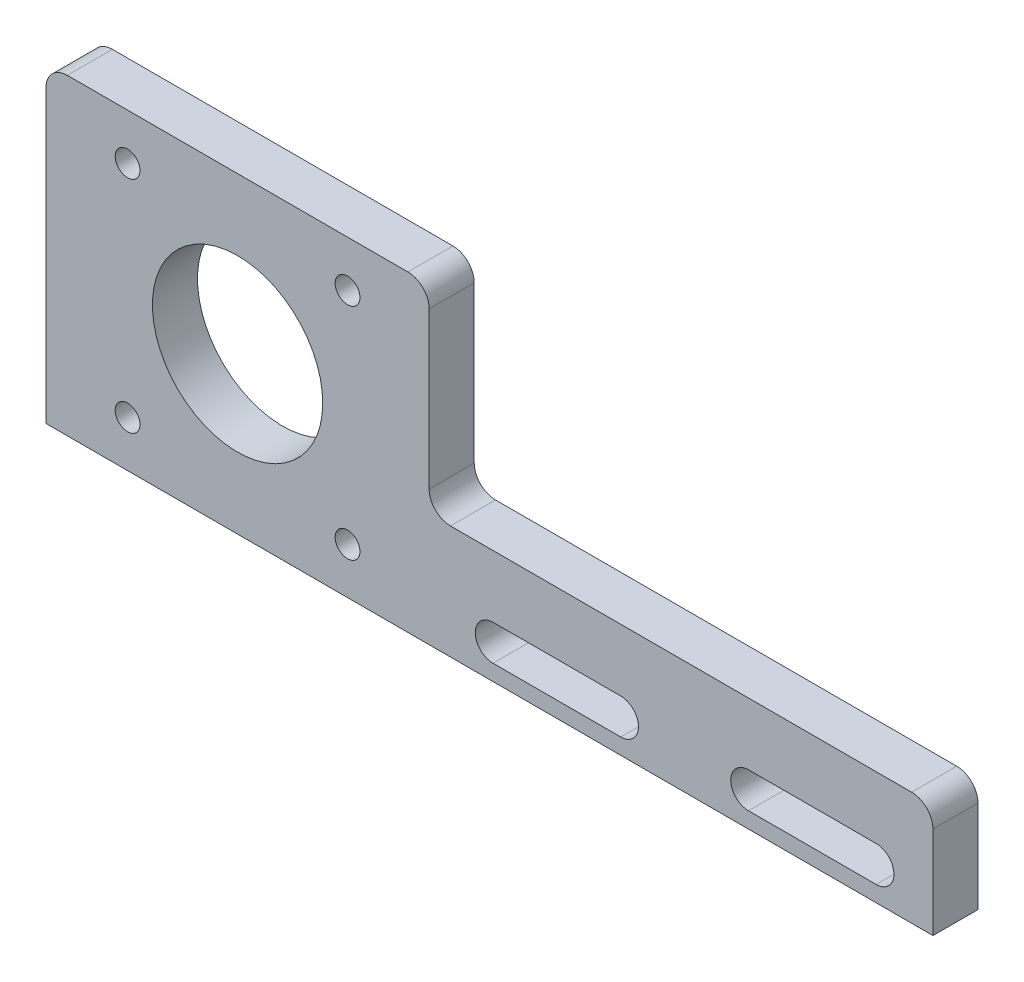
ISO-10303-21;
HEADER;
FILE_DESCRIPTION(('STEP AP214'),'2;1');
FILE_NAME('part.step','',(''),(''),'','','');
FILE_SCHEMA(('AUTOMOTIVE_DESIGN { 1 0 10303 214 1 1 1 1 }'));
ENDSEC;
DATA;
#1=APPLICATION_CONTEXT('core data for automotive mechanical design processes');
#2=APPLICATION_PROTOCOL_DEFINITION('international standard','automotive_design',2000,#1);
#3=PRODUCT_CONTEXT('',#1,'mechanical');
#4=PRODUCT('Part','Part','',(#3));
#5=PRODUCT_RELATED_PRODUCT_CATEGORY('part','',(#4));
#6=PRODUCT_DEFINITION_FORMATION('','',#4);
#7=PRODUCT_DEFINITION_CONTEXT('part definition',#1,'design');
#8=PRODUCT_DEFINITION('design','',#6,#7);
#9=PRODUCT_DEFINITION_SHAPE('','',#8);
#10=(LENGTH_UNIT() NAMED_UNIT(*) SI_UNIT(.MILLI.,.METRE.));
#11=(NAMED_UNIT(*) PLANE_ANGLE_UNIT() SI_UNIT($,.RADIAN.));
#12=(NAMED_UNIT(*) SI_UNIT($,.STERADIAN.) SOLID_ANGLE_UNIT());
#13=UNCERTAINTY_MEASURE_WITH_UNIT(LENGTH_MEASURE(1.E-05),#10,'distance_accuracy_value','');
#14=(GEOMETRIC_REPRESENTATION_CONTEXT(3) GLOBAL_UNCERTAINTY_ASSIGNED_CONTEXT((#13)) GLOBAL_UNIT_ASSIGNED_CONTEXT((#10,
#11,#12)) REPRESENTATION_CONTEXT('',''));
#15=CARTESIAN_POINT('',(0.,0.,0.));
#16=DIRECTION('',(0.,0.,1.));
#17=DIRECTION('',(1.,0.,0.));
#18=AXIS2_PLACEMENT_3D('',#15,#16,#17);
#19=CARTESIAN_POINT('',(0.,0.,6.35));
#20=DIRECTION('',(0.,0.,-1.));
#21=DIRECTION('',(-1.,0.,0.));
#22=AXIS2_PLACEMENT_3D('',#19,#20,#21);
#23=PLANE('',#22);
#24=CARTESIAN_POINT('',(71.5,-25.76,6.35));
#25=DIRECTION('',(0.,0.,1.));
#26=DIRECTION('',(1.,0.,0.));
#27=AXIS2_PLACEMENT_3D('',#24,#25,#26);
#28=CIRCLE('',#27,2.5);
#29=CARTESIAN_POINT('',(71.5,-23.26,6.35));
#30=VERTEX_POINT('',#29);
#31=CARTESIAN_POINT('',(71.5,-28.26,6.35));
#32=VERTEX_POINT('',#31);
#33=EDGE_CURVE('E205',#30,#32,#28,.T.);
#34=ORIENTED_EDGE('',*,*,#33,.F.);
#35=DIRECTION('',(-1.,0.,0.));
#36=VECTOR('',#35,1.);
#37=CARTESIAN_POINT('',(71.5,-23.26,6.35));
#38=LINE('',#37,#36);
#39=CARTESIAN_POINT('',(89.5,-23.26,6.35));
#40=VERTEX_POINT('',#39);
#41=EDGE_CURVE('E213',#40,#30,#38,.T.);
#42=ORIENTED_EDGE('',*,*,#41,.F.);
#43=CARTESIAN_POINT('',(89.5,-25.76,6.35));
#44=DIRECTION('',(0.,0.,1.));
#45=DIRECTION('',(1.,0.,0.));
#46=AXIS2_PLACEMENT_3D('',#43,#44,#45);
#47=CIRCLE('',#46,2.5);
#48=CARTESIAN_POINT('',(89.5,-28.26,6.35));
#49=VERTEX_POINT('',#48);
#50=EDGE_CURVE('E210',#49,#40,#47,.T.);
#51=ORIENTED_EDGE('',*,*,#50,.F.);
#52=DIRECTION('',(1.,0.,0.));
#53=VECTOR('',#52,1.);
#54=CARTESIAN_POINT('',(71.5,-28.26,6.35));
#55=LINE('',#54,#53);
#56=EDGE_CURVE('E207',#32,#49,#55,.T.);
#57=ORIENTED_EDGE('',*,*,#56,.F.);
#58=EDGE_LOOP('',(#34,#42,#51,#57));
#59=FACE_BOUND('',#58,.T.);
#60=CARTESIAN_POINT('',(-16.,-24.,6.35));
#61=DIRECTION('',(0.,0.,1.));
#62=DIRECTION('',(1.,0.,0.));
#63=AXIS2_PLACEMENT_3D('',#60,#61,#62);
#64=CIRCLE('',#63,1.75000000000001);
#65=CARTESIAN_POINT('',(-14.25,-24.,6.35));
#66=VERTEX_POINT('',#65);
#67=EDGE_CURVE('E242',#66,#66,#64,.T.);
#68=ORIENTED_EDGE('',*,*,#67,.F.);
#69=EDGE_LOOP('',(#68));
#70=FACE_BOUND('',#69,.T.);
#71=CARTESIAN_POINT('',(15.,6.99999999999999,6.35));
#72=DIRECTION('',(0.,0.,1.));
#73=DIRECTION('',(1.,0.,0.));
#74=AXIS2_PLACEMENT_3D('',#71,#72,#73);
#75=CIRCLE('',#74,1.75);
#76=CARTESIAN_POINT('',(16.75,6.99999999999999,6.35));
#77=VERTEX_POINT('',#76);
#78=EDGE_CURVE('E254',#77,#77,#75,.T.);
#79=ORIENTED_EDGE('',*,*,#78,.F.);
#80=EDGE_LOOP('',(#79));
#81=FACE_BOUND('',#80,.T.);
#82=DIRECTION('',(0.,1.,0.));
#83=VECTOR('',#82,1.);
#84=CARTESIAN_POINT('',(97.5,-30.5,6.35));
#85=LINE('',#84,#83);
#86=CARTESIAN_POINT('',(97.5,-30.5,6.35));
#87=VERTEX_POINT('',#86);
#88=CARTESIAN_POINT('',(97.5,-17.5,6.35));
#89=VERTEX_POINT('',#88);
#90=EDGE_CURVE('E271',#87,#89,#85,.T.);
#91=ORIENTED_EDGE('',*,*,#90,.T.);
#92=CARTESIAN_POINT('',(94.5,-17.5,6.35));
#93=DIRECTION('',(0.,0.,-1.));
#94=DIRECTION('',(-1.,0.,0.));
#95=AXIS2_PLACEMENT_3D('',#92,#93,#94);
#96=CIRCLE('',#95,3.);
#97=CARTESIAN_POINT('',(94.5,-14.5,6.35));
#98=VERTEX_POINT('',#97);
#99=EDGE_CURVE('E316',#89,#98,#96,.F.);
#100=ORIENTED_EDGE('',*,*,#99,.T.);
#101=DIRECTION('',(-1.,0.,0.));
#102=VECTOR('',#101,1.);
#103=CARTESIAN_POINT('',(97.5,-14.5,6.35));
#104=LINE('',#103,#102);
#105=CARTESIAN_POINT('',(29.5,-14.5,6.35));
#106=VERTEX_POINT('',#105);
#107=EDGE_CURVE('E274',#98,#106,#104,.T.);
#108=ORIENTED_EDGE('',*,*,#107,.T.);
#109=CARTESIAN_POINT('',(29.5,-11.5,6.35));
#110=DIRECTION('',(0.,0.,-1.));
#111=DIRECTION('',(-1.,0.,0.));
#112=AXIS2_PLACEMENT_3D('',#109,#110,#111);
#113=CIRCLE('',#112,3.);
#114=CARTESIAN_POINT('',(26.5,-11.5,6.35));
#115=VERTEX_POINT('',#114);
#116=EDGE_CURVE('E11',#106,#115,#113,.T.);
#117=ORIENTED_EDGE('',*,*,#116,.T.);
#118=DIRECTION('',(0.,1.,0.));
#119=VECTOR('',#118,1.);
#120=CARTESIAN_POINT('',(26.5,13.5,6.35));
#121=LINE('',#120,#119);
#122=CARTESIAN_POINT('',(26.5,10.5,6.35));
#123=VERTEX_POINT('',#122);
#124=EDGE_CURVE('E277',#115,#123,#121,.T.);
#125=ORIENTED_EDGE('',*,*,#124,.T.);
#126=CARTESIAN_POINT('',(23.5,10.5,6.35));
#127=DIRECTION('',(0.,0.,-1.));
#128=DIRECTION('',(-1.,0.,0.));
#129=AXIS2_PLACEMENT_3D('',#126,#127,#128);
#130=CIRCLE('',#129,3.);
#131=CARTESIAN_POINT('',(23.5,13.5,6.35));
#132=VERTEX_POINT('',#131);
#133=EDGE_CURVE('E59',#123,#132,#130,.F.);
#134=ORIENTED_EDGE('',*,*,#133,.T.);
#135=DIRECTION('',(-1.,0.,0.));
#136=VECTOR('',#135,1.);
#137=CARTESIAN_POINT('',(-27.5,13.5,6.35));
#138=LINE('',#137,#136);
#139=CARTESIAN_POINT('',(-24.5,13.5,6.35));
#140=VERTEX_POINT('',#139);
#141=EDGE_CURVE('E279',#132,#140,#138,.T.);
#142=ORIENTED_EDGE('',*,*,#141,.T.);
#143=CARTESIAN_POINT('',(-24.5,10.5,6.35));
#144=DIRECTION('',(0.,0.,-1.));
#145=DIRECTION('',(-1.,0.,0.));
#146=AXIS2_PLACEMENT_3D('',#143,#144,#145);
#147=CIRCLE('',#146,3.);
#148=CARTESIAN_POINT('',(-27.5,10.5,6.35));
#149=VERTEX_POINT('',#148);
#150=EDGE_CURVE('E313',#140,#149,#147,.F.);
#151=ORIENTED_EDGE('',*,*,#150,.T.);
#152=DIRECTION('',(0.,-1.,0.));
#153=VECTOR('',#152,1.);
#154=CARTESIAN_POINT('',(-27.5,-30.5,6.35));
#155=LINE('',#154,#153);
#156=CARTESIAN_POINT('',(-27.5,-30.5,6.35));
#157=VERTEX_POINT('',#156);
#158=EDGE_CURVE('E266',#149,#157,#155,.T.);
#159=ORIENTED_EDGE('',*,*,#158,.T.);
#160=DIRECTION('',(1.,0.,0.));
#161=VECTOR('',#160,1.);
#162=CARTESIAN_POINT('',(-27.5,-30.5,6.35));
#163=LINE('',#162,#161);
#164=EDGE_CURVE('E268',#157,#87,#163,.T.);
#165=ORIENTED_EDGE('',*,*,#164,.T.);
#166=EDGE_LOOP('',(#91,#100,#108,#117,#125,#134,#142,#151,#159,#165));
#167=FACE_BOUND('',#166,.T.);
#168=CARTESIAN_POINT('',(-16.,6.99999999999999,6.35));
#169=DIRECTION('',(0.,0.,1.));
#170=DIRECTION('',(1.,0.,0.));
#171=AXIS2_PLACEMENT_3D('',#168,#169,#170);
#172=CIRCLE('',#171,1.75000000000001);
#173=CARTESIAN_POINT('',(-14.25,6.99999999999999,6.35));
#174=VERTEX_POINT('',#173);
#175=EDGE_CURVE('E260',#174,#174,#172,.T.);
#176=ORIENTED_EDGE('',*,*,#175,.F.);
#177=EDGE_LOOP('',(#176));
#178=FACE_BOUND('',#177,.T.);
#179=CARTESIAN_POINT('',(15.,-24.,6.35));
#180=DIRECTION('',(0.,0.,1.));
#181=DIRECTION('',(1.,0.,0.));
#182=AXIS2_PLACEMENT_3D('',#179,#180,#181);
#183=CIRCLE('',#182,1.75);
#184=CARTESIAN_POINT('',(16.75,-24.,6.35));
#185=VERTEX_POINT('',#184);
#186=EDGE_CURVE('E248',#185,#185,#183,.T.);
#187=ORIENTED_EDGE('',*,*,#186,.F.);
#188=EDGE_LOOP('',(#187));
#189=FACE_BOUND('',#188,.T.);
#190=CARTESIAN_POINT('',(-0.499999999999998,-8.50000000000001,6.35));
#191=DIRECTION('',(0.,0.,1.));
#192=DIRECTION('',(1.,0.,0.));
#193=AXIS2_PLACEMENT_3D('',#190,#191,#192);
#194=CIRCLE('',#193,12.);
#195=CARTESIAN_POINT('',(11.5,-8.50000000000001,6.35));
#196=VERTEX_POINT('',#195);
#197=EDGE_CURVE('E236',#196,#196,#194,.T.);
#198=ORIENTED_EDGE('',*,*,#197,.F.);
#199=EDGE_LOOP('',(#198));
#200=FACE_BOUND('',#199,.T.);
#201=CARTESIAN_POINT('',(53.5,-25.76,6.35));
#202=DIRECTION('',(0.,0.,1.));
#203=DIRECTION('',(-1.,0.,0.));
#204=AXIS2_PLACEMENT_3D('',#201,#202,#203);
#205=CIRCLE('',#204,2.5);
#206=CARTESIAN_POINT('',(53.5,-28.26,6.35));
#207=VERTEX_POINT('',#206);
#208=CARTESIAN_POINT('',(53.5,-23.26,6.35));
#209=VERTEX_POINT('',#208);
#210=EDGE_CURVE('E164',#207,#209,#205,.T.);
#211=ORIENTED_EDGE('',*,*,#210,.F.);
#212=DIRECTION('',(1.,0.,0.));
#213=VECTOR('',#212,1.);
#214=CARTESIAN_POINT('',(53.5,-28.26,6.35));
#215=LINE('',#214,#213);
#216=CARTESIAN_POINT('',(35.5,-28.26,6.35));
#217=VERTEX_POINT('',#216);
#218=EDGE_CURVE('E189',#217,#207,#215,.T.);
#219=ORIENTED_EDGE('',*,*,#218,.F.);
#220=CARTESIAN_POINT('',(35.5,-25.76,6.35));
#221=DIRECTION('',(0.,0.,1.));
#222=DIRECTION('',(-1.,0.,0.));
#223=AXIS2_PLACEMENT_3D('',#220,#221,#222);
#224=CIRCLE('',#223,2.5);
#225=CARTESIAN_POINT('',(35.5,-23.26,6.35));
#226=VERTEX_POINT('',#225);
#227=EDGE_CURVE('E187',#226,#217,#224,.T.);
#228=ORIENTED_EDGE('',*,*,#227,.F.);
#229=DIRECTION('',(-1.,0.,0.));
#230=VECTOR('',#229,1.);
#231=CARTESIAN_POINT('',(53.5,-23.26,6.35));
#232=LINE('',#231,#230);
#233=EDGE_CURVE('E174',#209,#226,#232,.T.);
#234=ORIENTED_EDGE('',*,*,#233,.F.);
#235=EDGE_LOOP('',(#211,#219,#228,#234));
#236=FACE_BOUND('',#235,.T.);
#237=ADVANCED_FACE('F37',(#59,#70,#81,#167,#178,#189,#200,#236),#23,.F.);
#238=CARTESIAN_POINT('',(0.,0.,0.));
#239=DIRECTION('',(0.,0.,-1.));
#240=DIRECTION('',(-1.,0.,0.));
#241=AXIS2_PLACEMENT_3D('',#238,#239,#240);
#242=PLANE('',#241);
#243=DIRECTION('',(-1.,0.,0.));
#244=VECTOR('',#243,1.);
#245=CARTESIAN_POINT('',(71.5,-23.26,0.));
#246=LINE('',#245,#244);
#247=CARTESIAN_POINT('',(89.5,-23.26,0.));
#248=VERTEX_POINT('',#247);
#249=CARTESIAN_POINT('',(71.5,-23.26,0.));
#250=VERTEX_POINT('',#249);
#251=EDGE_CURVE('E208',#248,#250,#246,.T.);
#252=ORIENTED_EDGE('',*,*,#251,.T.);
#253=CARTESIAN_POINT('',(71.5,-25.76,0.));
#254=DIRECTION('',(0.,0.,1.));
#255=DIRECTION('',(1.,0.,0.));
#256=AXIS2_PLACEMENT_3D('',#253,#254,#255);
#257=CIRCLE('',#256,2.5);
#258=CARTESIAN_POINT('',(71.5,-28.26,0.));
#259=VERTEX_POINT('',#258);
#260=EDGE_CURVE('E182',#250,#259,#257,.T.);
#261=ORIENTED_EDGE('',*,*,#260,.T.);
#262=DIRECTION('',(1.,0.,0.));
#263=VECTOR('',#262,1.);
#264=CARTESIAN_POINT('',(71.5,-28.26,0.));
#265=LINE('',#264,#263);
#266=CARTESIAN_POINT('',(89.5,-28.26,0.));
#267=VERTEX_POINT('',#266);
#268=EDGE_CURVE('E218',#259,#267,#265,.T.);
#269=ORIENTED_EDGE('',*,*,#268,.T.);
#270=CARTESIAN_POINT('',(89.5,-25.76,0.));
#271=DIRECTION('',(0.,0.,1.));
#272=DIRECTION('',(1.,0.,0.));
#273=AXIS2_PLACEMENT_3D('',#270,#271,#272);
#274=CIRCLE('',#273,2.5);
#275=EDGE_CURVE('E221',#267,#248,#274,.T.);
#276=ORIENTED_EDGE('',*,*,#275,.T.);
#277=EDGE_LOOP('',(#252,#261,#269,#276));
#278=FACE_BOUND('',#277,.T.);
#279=CARTESIAN_POINT('',(-16.,-24.,0.));
#280=DIRECTION('',(0.,0.,1.));
#281=DIRECTION('',(1.,0.,0.));
#282=AXIS2_PLACEMENT_3D('',#279,#280,#281);
#283=CIRCLE('',#282,1.75000000000001);
#284=CARTESIAN_POINT('',(-14.25,-24.,0.));
#285=VERTEX_POINT('',#284);
#286=EDGE_CURVE('E239',#285,#285,#283,.T.);
#287=ORIENTED_EDGE('',*,*,#286,.T.);
#288=EDGE_LOOP('',(#287));
#289=FACE_BOUND('',#288,.T.);
#290=CARTESIAN_POINT('',(15.,6.99999999999999,0.));
#291=DIRECTION('',(0.,0.,1.));
#292=DIRECTION('',(1.,0.,0.));
#293=AXIS2_PLACEMENT_3D('',#290,#291,#292);
#294=CIRCLE('',#293,1.75);
#295=CARTESIAN_POINT('',(16.75,6.99999999999999,0.));
#296=VERTEX_POINT('',#295);
#297=EDGE_CURVE('E251',#296,#296,#294,.T.);
#298=ORIENTED_EDGE('',*,*,#297,.T.);
#299=EDGE_LOOP('',(#298));
#300=FACE_BOUND('',#299,.T.);
#301=DIRECTION('',(-1.,0.,0.));
#302=VECTOR('',#301,1.);
#303=CARTESIAN_POINT('',(97.5,-14.5,0.));
#304=LINE('',#303,#302);
#305=CARTESIAN_POINT('',(94.5,-14.5,0.));
#306=VERTEX_POINT('',#305);
#307=CARTESIAN_POINT('',(29.5,-14.5,0.));
#308=VERTEX_POINT('',#307);
#309=EDGE_CURVE('E288',#306,#308,#304,.T.);
#310=ORIENTED_EDGE('',*,*,#309,.F.);
#311=CARTESIAN_POINT('',(94.5,-17.5,0.));
#312=DIRECTION('',(0.,0.,-1.));
#313=DIRECTION('',(-1.,0.,0.));
#314=AXIS2_PLACEMENT_3D('',#311,#312,#313);
#315=CIRCLE('',#314,3.);
#316=CARTESIAN_POINT('',(97.5,-17.5,0.));
#317=VERTEX_POINT('',#316);
#318=EDGE_CURVE('E309',#306,#317,#315,.T.);
#319=ORIENTED_EDGE('',*,*,#318,.T.);
#320=DIRECTION('',(0.,1.,0.));
#321=VECTOR('',#320,1.);
#322=CARTESIAN_POINT('',(97.5,-30.5,0.));
#323=LINE('',#322,#321);
#324=CARTESIAN_POINT('',(97.5,-30.5,0.));
#325=VERTEX_POINT('',#324);
#326=EDGE_CURVE('E285',#325,#317,#323,.T.);
#327=ORIENTED_EDGE('',*,*,#326,.F.);
#328=DIRECTION('',(1.,0.,0.));
#329=VECTOR('',#328,1.);
#330=CARTESIAN_POINT('',(-27.5,-30.5,0.));
#331=LINE('',#330,#329);
#332=CARTESIAN_POINT('',(-27.5,-30.5,0.));
#333=VERTEX_POINT('',#332);
#334=EDGE_CURVE('E283',#333,#325,#331,.T.);
#335=ORIENTED_EDGE('',*,*,#334,.F.);
#336=DIRECTION('',(0.,-1.,0.));
#337=VECTOR('',#336,1.);
#338=CARTESIAN_POINT('',(-27.5,-30.5,0.));
#339=LINE('',#338,#337);
#340=CARTESIAN_POINT('',(-27.5,10.5,0.));
#341=VERTEX_POINT('',#340);
#342=EDGE_CURVE('E263',#341,#333,#339,.T.);
#343=ORIENTED_EDGE('',*,*,#342,.F.);
#344=CARTESIAN_POINT('',(-24.5,10.5,0.));
#345=DIRECTION('',(0.,0.,-1.));
#346=DIRECTION('',(-1.,0.,0.));
#347=AXIS2_PLACEMENT_3D('',#344,#345,#346);
#348=CIRCLE('',#347,3.);
#349=CARTESIAN_POINT('',(-24.5,13.5,0.));
#350=VERTEX_POINT('',#349);
#351=EDGE_CURVE('E305',#341,#350,#348,.T.);
#352=ORIENTED_EDGE('',*,*,#351,.T.);
#353=DIRECTION('',(-1.,0.,0.));
#354=VECTOR('',#353,1.);
#355=CARTESIAN_POINT('',(-27.5,13.5,0.));
#356=LINE('',#355,#354);
#357=CARTESIAN_POINT('',(23.5,13.5,0.));
#358=VERTEX_POINT('',#357);
#359=EDGE_CURVE('E269',#358,#350,#356,.T.);
#360=ORIENTED_EDGE('',*,*,#359,.F.);
#361=CARTESIAN_POINT('',(23.5,10.5,0.));
#362=DIRECTION('',(0.,0.,-1.));
#363=DIRECTION('',(-1.,0.,0.));
#364=AXIS2_PLACEMENT_3D('',#361,#362,#363);
#365=CIRCLE('',#364,3.);
#366=CARTESIAN_POINT('',(26.5,10.5,0.));
#367=VERTEX_POINT('',#366);
#368=EDGE_CURVE('E307',#358,#367,#365,.T.);
#369=ORIENTED_EDGE('',*,*,#368,.T.);
#370=DIRECTION('',(0.,1.,0.));
#371=VECTOR('',#370,1.);
#372=CARTESIAN_POINT('',(26.5,13.5,0.));
#373=LINE('',#372,#371);
#374=CARTESIAN_POINT('',(26.5,-11.5,0.));
#375=VERTEX_POINT('',#374);
#376=EDGE_CURVE('E291',#375,#367,#373,.T.);
#377=ORIENTED_EDGE('',*,*,#376,.F.);
#378=CARTESIAN_POINT('',(29.5,-11.5,0.));
#379=DIRECTION('',(0.,0.,-1.));
#380=DIRECTION('',(-1.,0.,0.));
#381=AXIS2_PLACEMENT_3D('',#378,#379,#380);
#382=CIRCLE('',#381,3.);
#383=EDGE_CURVE('E45',#375,#308,#382,.F.);
#384=ORIENTED_EDGE('',*,*,#383,.T.);
#385=EDGE_LOOP('',(#310,#319,#327,#335,#343,#352,#360,#369,#377,#384));
#386=FACE_BOUND('',#385,.T.);
#387=CARTESIAN_POINT('',(-16.,6.99999999999999,0.));
#388=DIRECTION('',(0.,0.,1.));
#389=DIRECTION('',(1.,0.,0.));
#390=AXIS2_PLACEMENT_3D('',#387,#388,#389);
#391=CIRCLE('',#390,1.75000000000001);
#392=CARTESIAN_POINT('',(-14.25,6.99999999999999,0.));
#393=VERTEX_POINT('',#392);
#394=EDGE_CURVE('E257',#393,#393,#391,.T.);
#395=ORIENTED_EDGE('',*,*,#394,.T.);
#396=EDGE_LOOP('',(#395));
#397=FACE_BOUND('',#396,.T.);
#398=CARTESIAN_POINT('',(15.,-24.,0.));
#399=DIRECTION('',(0.,0.,1.));
#400=DIRECTION('',(1.,0.,0.));
#401=AXIS2_PLACEMENT_3D('',#398,#399,#400);
#402=CIRCLE('',#401,1.75);
#403=CARTESIAN_POINT('',(16.75,-24.,0.));
#404=VERTEX_POINT('',#403);
#405=EDGE_CURVE('E245',#404,#404,#402,.T.);
#406=ORIENTED_EDGE('',*,*,#405,.T.);
#407=EDGE_LOOP('',(#406));
#408=FACE_BOUND('',#407,.T.);
#409=CARTESIAN_POINT('',(-0.499999999999998,-8.50000000000001,0.));
#410=DIRECTION('',(0.,0.,1.));
#411=DIRECTION('',(1.,0.,0.));
#412=AXIS2_PLACEMENT_3D('',#409,#410,#411);
#413=CIRCLE('',#412,12.);
#414=CARTESIAN_POINT('',(11.5,-8.50000000000001,0.));
#415=VERTEX_POINT('',#414);
#416=EDGE_CURVE('E235',#415,#415,#413,.T.);
#417=ORIENTED_EDGE('',*,*,#416,.T.);
#418=EDGE_LOOP('',(#417));
#419=FACE_BOUND('',#418,.T.);
#420=DIRECTION('',(1.,0.,0.));
#421=VECTOR('',#420,1.);
#422=CARTESIAN_POINT('',(53.5,-28.26,0.));
#423=LINE('',#422,#421);
#424=CARTESIAN_POINT('',(35.5,-28.26,0.));
#425=VERTEX_POINT('',#424);
#426=CARTESIAN_POINT('',(53.5,-28.26,0.));
#427=VERTEX_POINT('',#426);
#428=EDGE_CURVE('E175',#425,#427,#423,.T.);
#429=ORIENTED_EDGE('',*,*,#428,.T.);
#430=CARTESIAN_POINT('',(53.5,-25.76,0.));
#431=DIRECTION('',(0.,0.,1.));
#432=DIRECTION('',(-1.,0.,0.));
#433=AXIS2_PLACEMENT_3D('',#430,#431,#432);
#434=CIRCLE('',#433,2.5);
#435=CARTESIAN_POINT('',(53.5,-23.26,0.));
#436=VERTEX_POINT('',#435);
#437=EDGE_CURVE('E193',#427,#436,#434,.T.);
#438=ORIENTED_EDGE('',*,*,#437,.T.);
#439=DIRECTION('',(-1.,0.,0.));
#440=VECTOR('',#439,1.);
#441=CARTESIAN_POINT('',(53.5,-23.26,0.));
#442=LINE('',#441,#440);
#443=CARTESIAN_POINT('',(35.5,-23.26,0.));
#444=VERTEX_POINT('',#443);
#445=EDGE_CURVE('E181',#436,#444,#442,.T.);
#446=ORIENTED_EDGE('',*,*,#445,.T.);
#447=CARTESIAN_POINT('',(35.5,-25.76,0.));
#448=DIRECTION('',(0.,0.,1.));
#449=DIRECTION('',(-1.,0.,0.));
#450=AXIS2_PLACEMENT_3D('',#447,#448,#449);
#451=CIRCLE('',#450,2.5);
#452=EDGE_CURVE('E196',#444,#425,#451,.T.);
#453=ORIENTED_EDGE('',*,*,#452,.T.);
#454=EDGE_LOOP('',(#429,#438,#446,#453));
#455=FACE_BOUND('',#454,.T.);
#456=ADVANCED_FACE('F332',(#278,#289,#300,#386,#397,#408,#419,#455),#242,.T.);
#457=CARTESIAN_POINT('',(-27.5,-30.5,6.35));
#458=DIRECTION('',(1.,0.,0.));
#459=DIRECTION('',(0.,0.,-1.));
#460=AXIS2_PLACEMENT_3D('',#457,#458,#459);
#461=PLANE('',#460);
#462=ORIENTED_EDGE('',*,*,#158,.F.);
#463=DIRECTION('',(0.,0.,-1.));
#464=VECTOR('',#463,1.);
#465=CARTESIAN_POINT('',(-27.5,10.5,6.35));
#466=LINE('',#465,#464);
#467=EDGE_CURVE('E327',#149,#341,#466,.T.);
#468=ORIENTED_EDGE('',*,*,#467,.T.);
#469=ORIENTED_EDGE('',*,*,#342,.T.);
#470=DIRECTION('',(0.,0.,-1.));
#471=VECTOR('',#470,1.);
#472=CARTESIAN_POINT('',(-27.5,-30.5,6.35));
#473=LINE('',#472,#471);
#474=EDGE_CURVE('E297',#157,#333,#473,.T.);
#475=ORIENTED_EDGE('',*,*,#474,.F.);
#476=EDGE_LOOP('',(#462,#468,#469,#475));
#477=FACE_BOUND('',#476,.T.);
#478=ADVANCED_FACE('F360',(#477),#461,.F.);
#479=CARTESIAN_POINT('',(-27.5,-30.5,6.35));
#480=DIRECTION('',(0.,1.,0.));
#481=DIRECTION('',(-1.,0.,0.));
#482=AXIS2_PLACEMENT_3D('',#479,#480,#481);
#483=PLANE('',#482);
#484=ORIENTED_EDGE('',*,*,#334,.T.);
#485=DIRECTION('',(0.,0.,-1.));
#486=VECTOR('',#485,1.);
#487=CARTESIAN_POINT('',(97.5,-30.5,6.35));
#488=LINE('',#487,#486);
#489=EDGE_CURVE('E281',#87,#325,#488,.T.);
#490=ORIENTED_EDGE('',*,*,#489,.F.);
#491=ORIENTED_EDGE('',*,*,#164,.F.);
#492=ORIENTED_EDGE('',*,*,#474,.T.);
#493=EDGE_LOOP('',(#484,#490,#491,#492));
#494=FACE_BOUND('',#493,.T.);
#495=ADVANCED_FACE('F365',(#494),#483,.F.);
#496=CARTESIAN_POINT('',(97.5,-30.5,6.35));
#497=DIRECTION('',(-1.,0.,0.));
#498=DIRECTION('',(0.,0.,1.));
#499=AXIS2_PLACEMENT_3D('',#496,#497,#498);
#500=PLANE('',#499);
#501=ORIENTED_EDGE('',*,*,#326,.T.);
#502=DIRECTION('',(0.,0.,-1.));
#503=VECTOR('',#502,1.);
#504=CARTESIAN_POINT('',(97.5,-17.5,6.35));
#505=LINE('',#504,#503);
#506=EDGE_CURVE('E311',#317,#89,#505,.F.);
#507=ORIENTED_EDGE('',*,*,#506,.T.);
#508=ORIENTED_EDGE('',*,*,#90,.F.);
#509=ORIENTED_EDGE('',*,*,#489,.T.);
#510=EDGE_LOOP('',(#501,#507,#508,#509));
#511=FACE_BOUND('',#510,.T.);
#512=ADVANCED_FACE('F369',(#511),#500,.F.);
#513=CARTESIAN_POINT('',(97.5,-14.5,6.35));
#514=DIRECTION('',(0.,-1.,0.));
#515=DIRECTION('',(0.,0.,-1.));
#516=AXIS2_PLACEMENT_3D('',#513,#514,#515);
#517=PLANE('',#516);
#518=ORIENTED_EDGE('',*,*,#107,.F.);
#519=DIRECTION('',(0.,0.,-1.));
#520=VECTOR('',#519,1.);
#521=CARTESIAN_POINT('',(94.5,-14.5,6.35));
#522=LINE('',#521,#520);
#523=EDGE_CURVE('E302',#98,#306,#522,.T.);
#524=ORIENTED_EDGE('',*,*,#523,.T.);
#525=ORIENTED_EDGE('',*,*,#309,.T.);
#526=DIRECTION('',(0.,0.,-1.));
#527=VECTOR('',#526,1.);
#528=CARTESIAN_POINT('',(29.5,-14.5,6.35));
#529=LINE('',#528,#527);
#530=EDGE_CURVE('E300',#308,#106,#529,.F.);
#531=ORIENTED_EDGE('',*,*,#530,.T.);
#532=EDGE_LOOP('',(#518,#524,#525,#531));
#533=FACE_BOUND('',#532,.T.);
#534=ADVANCED_FACE('F339',(#533),#517,.F.);
#535=CARTESIAN_POINT('',(26.5,13.5,6.35));
#536=DIRECTION('',(-1.,0.,0.));
#537=DIRECTION('',(0.,0.,1.));
#538=AXIS2_PLACEMENT_3D('',#535,#536,#537);
#539=PLANE('',#538);
#540=ORIENTED_EDGE('',*,*,#124,.F.);
#541=DIRECTION('',(0.,0.,-1.));
#542=VECTOR('',#541,1.);
#543=CARTESIAN_POINT('',(26.5,-11.5,0.));
#544=LINE('',#543,#542);
#545=EDGE_CURVE('E320',#115,#375,#544,.T.);
#546=ORIENTED_EDGE('',*,*,#545,.T.);
#547=ORIENTED_EDGE('',*,*,#376,.T.);
#548=DIRECTION('',(0.,0.,-1.));
#549=VECTOR('',#548,1.);
#550=CARTESIAN_POINT('',(26.5,10.5,6.35));
#551=LINE('',#550,#549);
#552=EDGE_CURVE('E318',#367,#123,#551,.F.);
#553=ORIENTED_EDGE('',*,*,#552,.T.);
#554=EDGE_LOOP('',(#540,#546,#547,#553));
#555=FACE_BOUND('',#554,.T.);
#556=ADVANCED_FACE('F346',(#555),#539,.F.);
#557=CARTESIAN_POINT('',(-27.5,13.5,6.35));
#558=DIRECTION('',(0.,-1.,0.));
#559=DIRECTION('',(0.,0.,-1.));
#560=AXIS2_PLACEMENT_3D('',#557,#558,#559);
#561=PLANE('',#560);
#562=ORIENTED_EDGE('',*,*,#141,.F.);
#563=DIRECTION('',(0.,0.,-1.));
#564=VECTOR('',#563,1.);
#565=CARTESIAN_POINT('',(23.5,13.5,6.35));
#566=LINE('',#565,#564);
#567=EDGE_CURVE('E324',#132,#358,#566,.T.);
#568=ORIENTED_EDGE('',*,*,#567,.T.);
#569=ORIENTED_EDGE('',*,*,#359,.T.);
#570=DIRECTION('',(0.,0.,-1.));
#571=VECTOR('',#570,1.);
#572=CARTESIAN_POINT('',(-24.5,13.5,6.35));
#573=LINE('',#572,#571);
#574=EDGE_CURVE('E52',#350,#140,#573,.F.);
#575=ORIENTED_EDGE('',*,*,#574,.T.);
#576=EDGE_LOOP('',(#562,#568,#569,#575));
#577=FACE_BOUND('',#576,.T.);
#578=ADVANCED_FACE('F352',(#577),#561,.F.);
#579=CARTESIAN_POINT('',(-16.,6.99999999999999,6.35));
#580=DIRECTION('',(0.,0.,-1.));
#581=DIRECTION('',(-1.,0.,0.));
#582=AXIS2_PLACEMENT_3D('',#579,#580,#581);
#583=CYLINDRICAL_SURFACE('',#582,1.75000000000001);
#584=ORIENTED_EDGE('',*,*,#175,.T.);
#585=EDGE_LOOP('',(#584));
#586=FACE_BOUND('',#585,.T.);
#587=ORIENTED_EDGE('',*,*,#394,.F.);
#588=EDGE_LOOP('',(#587));
#589=FACE_BOUND('',#588,.T.);
#590=ADVANCED_FACE('F397',(#586,#589),#583,.F.);
#591=CARTESIAN_POINT('',(15.,6.99999999999999,6.35));
#592=DIRECTION('',(0.,0.,-1.));
#593=DIRECTION('',(-1.,0.,0.));
#594=AXIS2_PLACEMENT_3D('',#591,#592,#593);
#595=CYLINDRICAL_SURFACE('',#594,1.75);
#596=ORIENTED_EDGE('',*,*,#78,.T.);
#597=EDGE_LOOP('',(#596));
#598=FACE_BOUND('',#597,.T.);
#599=ORIENTED_EDGE('',*,*,#297,.F.);
#600=EDGE_LOOP('',(#599));
#601=FACE_BOUND('',#600,.T.);
#602=ADVANCED_FACE('F440',(#598,#601),#595,.F.);
#603=CARTESIAN_POINT('',(15.,-24.,6.35));
#604=DIRECTION('',(0.,0.,-1.));
#605=DIRECTION('',(-1.,0.,0.));
#606=AXIS2_PLACEMENT_3D('',#603,#604,#605);
#607=CYLINDRICAL_SURFACE('',#606,1.75);
#608=ORIENTED_EDGE('',*,*,#186,.T.);
#609=EDGE_LOOP('',(#608));
#610=FACE_BOUND('',#609,.T.);
#611=ORIENTED_EDGE('',*,*,#405,.F.);
#612=EDGE_LOOP('',(#611));
#613=FACE_BOUND('',#612,.T.);
#614=ADVANCED_FACE('F447',(#610,#613),#607,.F.);
#615=CARTESIAN_POINT('',(-16.,-24.,6.35));
#616=DIRECTION('',(0.,0.,-1.));
#617=DIRECTION('',(-1.,0.,0.));
#618=AXIS2_PLACEMENT_3D('',#615,#616,#617);
#619=CYLINDRICAL_SURFACE('',#618,1.75000000000001);
#620=ORIENTED_EDGE('',*,*,#67,.T.);
#621=EDGE_LOOP('',(#620));
#622=FACE_BOUND('',#621,.T.);
#623=ORIENTED_EDGE('',*,*,#286,.F.);
#624=EDGE_LOOP('',(#623));
#625=FACE_BOUND('',#624,.T.);
#626=ADVANCED_FACE('F454',(#622,#625),#619,.F.);
#627=CARTESIAN_POINT('',(-0.499999999999998,-8.50000000000001,6.35));
#628=DIRECTION('',(0.,0.,-1.));
#629=DIRECTION('',(-1.,0.,0.));
#630=AXIS2_PLACEMENT_3D('',#627,#628,#629);
#631=CYLINDRICAL_SURFACE('',#630,12.);
#632=ORIENTED_EDGE('',*,*,#197,.T.);
#633=EDGE_LOOP('',(#632));
#634=FACE_BOUND('',#633,.T.);
#635=ORIENTED_EDGE('',*,*,#416,.F.);
#636=EDGE_LOOP('',(#635));
#637=FACE_BOUND('',#636,.T.);
#638=ADVANCED_FACE('F462',(#634,#637),#631,.F.);
#639=CARTESIAN_POINT('',(71.5,-25.76,6.35));
#640=DIRECTION('',(0.,0.,-1.));
#641=DIRECTION('',(-1.,0.,0.));
#642=AXIS2_PLACEMENT_3D('',#639,#640,#641);
#643=CYLINDRICAL_SURFACE('',#642,2.5);
#644=ORIENTED_EDGE('',*,*,#260,.F.);
#645=DIRECTION('',(0.,0.,-1.));
#646=VECTOR('',#645,1.);
#647=CARTESIAN_POINT('',(71.5,-23.26,6.35));
#648=LINE('',#647,#646);
#649=EDGE_CURVE('E215',#30,#250,#648,.T.);
#650=ORIENTED_EDGE('',*,*,#649,.F.);
#651=ORIENTED_EDGE('',*,*,#33,.T.);
#652=DIRECTION('',(0.,0.,-1.));
#653=VECTOR('',#652,1.);
#654=CARTESIAN_POINT('',(71.5,-28.26,6.35));
#655=LINE('',#654,#653);
#656=EDGE_CURVE('E232',#32,#259,#655,.T.);
#657=ORIENTED_EDGE('',*,*,#656,.T.);
#658=EDGE_LOOP('',(#644,#650,#651,#657));
#659=FACE_BOUND('',#658,.T.);
#660=ADVANCED_FACE('F470',(#659),#643,.F.);
#661=CARTESIAN_POINT('',(71.5,-28.26,6.35));
#662=DIRECTION('',(0.,1.,0.));
#663=DIRECTION('',(0.,0.,1.));
#664=AXIS2_PLACEMENT_3D('',#661,#662,#663);
#665=PLANE('',#664);
#666=ORIENTED_EDGE('',*,*,#268,.F.);
#667=ORIENTED_EDGE('',*,*,#656,.F.);
#668=ORIENTED_EDGE('',*,*,#56,.T.);
#669=DIRECTION('',(0.,0.,-1.));
#670=VECTOR('',#669,1.);
#671=CARTESIAN_POINT('',(89.5,-28.26,6.35));
#672=LINE('',#671,#670);
#673=EDGE_CURVE('E230',#49,#267,#672,.T.);
#674=ORIENTED_EDGE('',*,*,#673,.T.);
#675=EDGE_LOOP('',(#666,#667,#668,#674));
#676=FACE_BOUND('',#675,.T.);
#677=ADVANCED_FACE('F478',(#676),#665,.T.);
#678=CARTESIAN_POINT('',(89.5,-25.76,6.35));
#679=DIRECTION('',(0.,0.,-1.));
#680=DIRECTION('',(-1.,0.,0.));
#681=AXIS2_PLACEMENT_3D('',#678,#679,#680);
#682=CYLINDRICAL_SURFACE('',#681,2.5);
#683=ORIENTED_EDGE('',*,*,#275,.F.);
#684=ORIENTED_EDGE('',*,*,#673,.F.);
#685=ORIENTED_EDGE('',*,*,#50,.T.);
#686=DIRECTION('',(0.,0.,-1.));
#687=VECTOR('',#686,1.);
#688=CARTESIAN_POINT('',(89.5,-23.26,6.35));
#689=LINE('',#688,#687);
#690=EDGE_CURVE('E228',#40,#248,#689,.T.);
#691=ORIENTED_EDGE('',*,*,#690,.T.);
#692=EDGE_LOOP('',(#683,#684,#685,#691));
#693=FACE_BOUND('',#692,.T.);
#694=ADVANCED_FACE('F486',(#693),#682,.F.);
#695=CARTESIAN_POINT('',(71.5,-23.26,6.35));
#696=DIRECTION('',(0.,-1.,0.));
#697=DIRECTION('',(0.,0.,-1.));
#698=AXIS2_PLACEMENT_3D('',#695,#696,#697);
#699=PLANE('',#698);
#700=ORIENTED_EDGE('',*,*,#251,.F.);
#701=ORIENTED_EDGE('',*,*,#690,.F.);
#702=ORIENTED_EDGE('',*,*,#41,.T.);
#703=ORIENTED_EDGE('',*,*,#649,.T.);
#704=EDGE_LOOP('',(#700,#701,#702,#703));
#705=FACE_BOUND('',#704,.T.);
#706=ADVANCED_FACE('F494',(#705),#699,.T.);
#707=CARTESIAN_POINT('',(53.5,-25.76,6.35));
#708=DIRECTION('',(0.,0.,-1.));
#709=DIRECTION('',(-1.,0.,0.));
#710=AXIS2_PLACEMENT_3D('',#707,#708,#709);
#711=CYLINDRICAL_SURFACE('',#710,2.5);
#712=ORIENTED_EDGE('',*,*,#437,.F.);
#713=DIRECTION('',(0.,0.,-1.));
#714=VECTOR('',#713,1.);
#715=CARTESIAN_POINT('',(53.5,-28.26,6.35));
#716=LINE('',#715,#714);
#717=EDGE_CURVE('E170',#207,#427,#716,.T.);
#718=ORIENTED_EDGE('',*,*,#717,.F.);
#719=ORIENTED_EDGE('',*,*,#210,.T.);
#720=DIRECTION('',(0.,0.,-1.));
#721=VECTOR('',#720,1.);
#722=CARTESIAN_POINT('',(53.5,-23.26,6.35));
#723=LINE('',#722,#721);
#724=EDGE_CURVE('E167',#209,#436,#723,.T.);
#725=ORIENTED_EDGE('',*,*,#724,.T.);
#726=EDGE_LOOP('',(#712,#718,#719,#725));
#727=FACE_BOUND('',#726,.T.);
#728=ADVANCED_FACE('F166',(#727),#711,.F.);
#729=CARTESIAN_POINT('',(53.5,-23.26,6.35));
#730=DIRECTION('',(0.,-1.,0.));
#731=DIRECTION('',(1.,0.,0.));
#732=AXIS2_PLACEMENT_3D('',#729,#730,#731);
#733=PLANE('',#732);
#734=ORIENTED_EDGE('',*,*,#445,.F.);
#735=ORIENTED_EDGE('',*,*,#724,.F.);
#736=ORIENTED_EDGE('',*,*,#233,.T.);
#737=DIRECTION('',(0.,0.,-1.));
#738=VECTOR('',#737,1.);
#739=CARTESIAN_POINT('',(35.5,-23.26,6.35));
#740=LINE('',#739,#738);
#741=EDGE_CURVE('E183',#226,#444,#740,.T.);
#742=ORIENTED_EDGE('',*,*,#741,.T.);
#743=EDGE_LOOP('',(#734,#735,#736,#742));
#744=FACE_BOUND('',#743,.T.);
#745=ADVANCED_FACE('F178',(#744),#733,.T.);
#746=CARTESIAN_POINT('',(35.5,-25.76,6.35));
#747=DIRECTION('',(0.,0.,-1.));
#748=DIRECTION('',(-1.,0.,0.));
#749=AXIS2_PLACEMENT_3D('',#746,#747,#748);
#750=CYLINDRICAL_SURFACE('',#749,2.5);
#751=ORIENTED_EDGE('',*,*,#452,.F.);
#752=ORIENTED_EDGE('',*,*,#741,.F.);
#753=ORIENTED_EDGE('',*,*,#227,.T.);
#754=DIRECTION('',(0.,0.,-1.));
#755=VECTOR('',#754,1.);
#756=CARTESIAN_POINT('',(35.5,-28.26,6.35));
#757=LINE('',#756,#755);
#758=EDGE_CURVE('E202',#217,#425,#757,.T.);
#759=ORIENTED_EDGE('',*,*,#758,.T.);
#760=EDGE_LOOP('',(#751,#752,#753,#759));
#761=FACE_BOUND('',#760,.T.);
#762=ADVANCED_FACE('F382',(#761),#750,.F.);
#763=CARTESIAN_POINT('',(53.5,-28.26,6.35));
#764=DIRECTION('',(0.,1.,0.));
#765=DIRECTION('',(0.,0.,1.));
#766=AXIS2_PLACEMENT_3D('',#763,#764,#765);
#767=PLANE('',#766);
#768=ORIENTED_EDGE('',*,*,#428,.F.);
#769=ORIENTED_EDGE('',*,*,#758,.F.);
#770=ORIENTED_EDGE('',*,*,#218,.T.);
#771=ORIENTED_EDGE('',*,*,#717,.T.);
#772=EDGE_LOOP('',(#768,#769,#770,#771));
#773=FACE_BOUND('',#772,.T.);
#774=ADVANCED_FACE('F375',(#773),#767,.T.);
#775=CARTESIAN_POINT('',(94.5,-17.5,6.35));
#776=DIRECTION('',(0.,0.,-1.));
#777=DIRECTION('',(-1.,0.,0.));
#778=AXIS2_PLACEMENT_3D('',#775,#776,#777);
#779=CYLINDRICAL_SURFACE('',#778,3.);
#780=ORIENTED_EDGE('',*,*,#99,.F.);
#781=ORIENTED_EDGE('',*,*,#506,.F.);
#782=ORIENTED_EDGE('',*,*,#318,.F.);
#783=ORIENTED_EDGE('',*,*,#523,.F.);
#784=EDGE_LOOP('',(#780,#781,#782,#783));
#785=FACE_BOUND('',#784,.T.);
#786=ADVANCED_FACE('F373',(#785),#779,.T.);
#787=CARTESIAN_POINT('',(29.5,-11.5,6.35));
#788=DIRECTION('',(0.,0.,1.));
#789=DIRECTION('',(1.,0.,0.));
#790=AXIS2_PLACEMENT_3D('',#787,#788,#789);
#791=CYLINDRICAL_SURFACE('',#790,3.);
#792=ORIENTED_EDGE('',*,*,#116,.F.);
#793=ORIENTED_EDGE('',*,*,#530,.F.);
#794=ORIENTED_EDGE('',*,*,#383,.F.);
#795=ORIENTED_EDGE('',*,*,#545,.F.);
#796=EDGE_LOOP('',(#792,#793,#794,#795));
#797=FACE_BOUND('',#796,.T.);
#798=ADVANCED_FACE('F342',(#797),#791,.F.);
#799=CARTESIAN_POINT('',(23.5,10.5,6.35));
#800=DIRECTION('',(0.,0.,-1.));
#801=DIRECTION('',(-1.,0.,0.));
#802=AXIS2_PLACEMENT_3D('',#799,#800,#801);
#803=CYLINDRICAL_SURFACE('',#802,3.);
#804=ORIENTED_EDGE('',*,*,#133,.F.);
#805=ORIENTED_EDGE('',*,*,#552,.F.);
#806=ORIENTED_EDGE('',*,*,#368,.F.);
#807=ORIENTED_EDGE('',*,*,#567,.F.);
#808=EDGE_LOOP('',(#804,#805,#806,#807));
#809=FACE_BOUND('',#808,.T.);
#810=ADVANCED_FACE('F349',(#809),#803,.T.);
#811=CARTESIAN_POINT('',(-24.5,10.5,6.35));
#812=DIRECTION('',(0.,0.,-1.));
#813=DIRECTION('',(-1.,0.,0.));
#814=AXIS2_PLACEMENT_3D('',#811,#812,#813);
#815=CYLINDRICAL_SURFACE('',#814,3.);
#816=ORIENTED_EDGE('',*,*,#150,.F.);
#817=ORIENTED_EDGE('',*,*,#574,.F.);
#818=ORIENTED_EDGE('',*,*,#351,.F.);
#819=ORIENTED_EDGE('',*,*,#467,.F.);
#820=EDGE_LOOP('',(#816,#817,#818,#819));
#821=FACE_BOUND('',#820,.T.);
#822=ADVANCED_FACE('F39',(#821),#815,.T.);
#823=CLOSED_SHELL('',(#237,#456,#478,#495,#512,#534,#556,#578,#590,#602,#614,#626,#638,#660,
#677,#694,#706,#728,#745,#762,#774,#786,#798,#810,#822));
#824=MANIFOLD_SOLID_BREP('B2',#823);
#825=ADVANCED_BREP_SHAPE_REPRESENTATION('',(#18,#824),#14);
#826=SHAPE_DEFINITION_REPRESENTATION(#9,#825);
ENDSEC;
END-ISO-10303-21;
